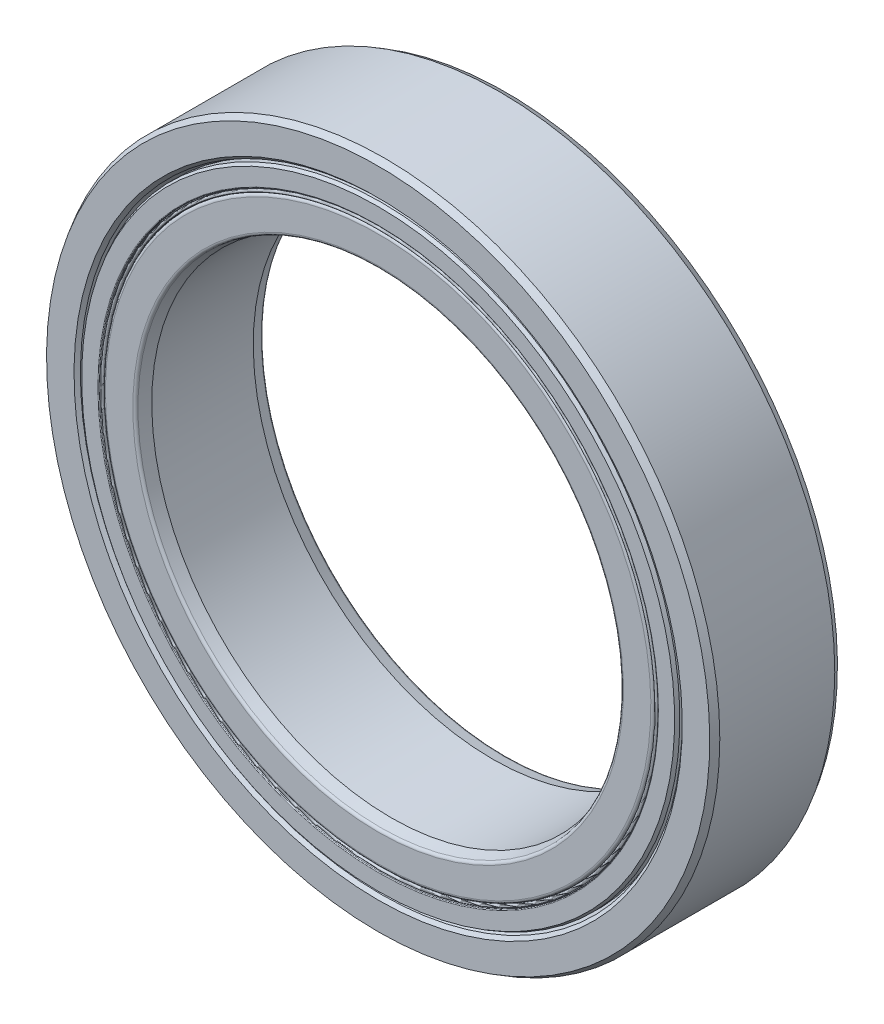
ISO-10303-21;
HEADER;
FILE_DESCRIPTION(('STEP AP214'),'2;1');
FILE_NAME('part.step','',(''),(''),'','','');
FILE_SCHEMA(('AUTOMOTIVE_DESIGN { 1 0 10303 214 1 1 1 1 }'));
ENDSEC;
DATA;
#1=APPLICATION_CONTEXT('core data for automotive mechanical design processes');
#2=APPLICATION_PROTOCOL_DEFINITION('international standard','automotive_design',2000,#1);
#3=PRODUCT_CONTEXT('',#1,'mechanical');
#4=PRODUCT('Part','Part','',(#3));
#5=PRODUCT_RELATED_PRODUCT_CATEGORY('part','',(#4));
#6=PRODUCT_DEFINITION_FORMATION('','',#4);
#7=PRODUCT_DEFINITION_CONTEXT('part definition',#1,'design');
#8=PRODUCT_DEFINITION('design','',#6,#7);
#9=PRODUCT_DEFINITION_SHAPE('','',#8);
#10=(LENGTH_UNIT() NAMED_UNIT(*) SI_UNIT(.MILLI.,.METRE.));
#11=(NAMED_UNIT(*) PLANE_ANGLE_UNIT() SI_UNIT($,.RADIAN.));
#12=(NAMED_UNIT(*) SI_UNIT($,.STERADIAN.) SOLID_ANGLE_UNIT());
#13=UNCERTAINTY_MEASURE_WITH_UNIT(LENGTH_MEASURE(1.E-05),#10,'distance_accuracy_value','');
#14=(GEOMETRIC_REPRESENTATION_CONTEXT(3) GLOBAL_UNCERTAINTY_ASSIGNED_CONTEXT((#13)) GLOBAL_UNIT_ASSIGNED_CONTEXT((#10,
#11,#12)) REPRESENTATION_CONTEXT('',''));
#15=CARTESIAN_POINT('',(0.,0.,0.));
#16=DIRECTION('',(0.,0.,1.));
#17=DIRECTION('',(1.,0.,0.));
#18=AXIS2_PLACEMENT_3D('',#15,#16,#17);
#19=CARTESIAN_POINT('',(0.,8.635,1.125));
#20=DIRECTION('',(0.,0.,1.));
#21=DIRECTION('',(0.,-1.,0.));
#22=AXIS2_PLACEMENT_3D('',#19,#20,#21);
#23=PLANE('',#22);
#24=CARTESIAN_POINT('',(0.,0.,1.125));
#25=DIRECTION('',(0.,0.,1.));
#26=DIRECTION('',(0.,-1.,0.));
#27=AXIS2_PLACEMENT_3D('',#24,#25,#26);
#28=CIRCLE('',#27,8.755);
#29=CARTESIAN_POINT('',(0.,-8.755,1.125));
#30=VERTEX_POINT('',#29);
#31=EDGE_CURVE('E11',#30,#30,#28,.T.);
#32=ORIENTED_EDGE('',*,*,#31,.F.);
#33=EDGE_LOOP('',(#32));
#34=FACE_BOUND('',#33,.T.);
#35=CARTESIAN_POINT('',(0.,0.,1.125));
#36=DIRECTION('',(0.,0.,1.));
#37=DIRECTION('',(0.,-1.,0.));
#38=AXIS2_PLACEMENT_3D('',#35,#36,#37);
#39=CIRCLE('',#38,8.635);
#40=CARTESIAN_POINT('',(0.,-8.635,1.125));
#41=VERTEX_POINT('',#40);
#42=EDGE_CURVE('E66',#41,#41,#39,.T.);
#43=ORIENTED_EDGE('',*,*,#42,.T.);
#44=EDGE_LOOP('',(#43));
#45=FACE_BOUND('',#44,.T.);
#46=ADVANCED_FACE('F41',(#34,#45),#23,.F.);
#47=CARTESIAN_POINT('',(0.,0.,2.));
#48=DIRECTION('',(0.,0.,1.));
#49=DIRECTION('',(0.,-1.,0.));
#50=AXIS2_PLACEMENT_3D('',#47,#48,#49);
#51=CYLINDRICAL_SURFACE('',#50,8.755);
#52=CARTESIAN_POINT('',(0.,0.,1.90262465990578));
#53=DIRECTION('',(0.,0.,1.));
#54=DIRECTION('',(0.,-1.,0.));
#55=AXIS2_PLACEMENT_3D('',#52,#53,#54);
#56=CIRCLE('',#55,8.755);
#57=CARTESIAN_POINT('',(0.,-8.755,1.90262465990578));
#58=VERTEX_POINT('',#57);
#59=EDGE_CURVE('E47',#58,#58,#56,.T.);
#60=ORIENTED_EDGE('',*,*,#59,.F.);
#61=EDGE_LOOP('',(#60));
#62=FACE_BOUND('',#61,.T.);
#63=ORIENTED_EDGE('',*,*,#31,.T.);
#64=EDGE_LOOP('',(#63));
#65=FACE_BOUND('',#64,.T.);
#66=ADVANCED_FACE('F97',(#62,#65),#51,.T.);
#67=CARTESIAN_POINT('',(0.,0.,1.90262465990578));
#68=DIRECTION('',(0.,0.,-1.));
#69=DIRECTION('',(0.,1.,0.));
#70=AXIS2_PLACEMENT_3D('',#67,#68,#69);
#71=CONICAL_SURFACE('',#70,8.755,0.174532925199435);
#72=CARTESIAN_POINT('',(0.,0.,1.93216889249614));
#73=DIRECTION('',(0.,0.,1.));
#74=DIRECTION('',(0.,-1.,0.));
#75=AXIS2_PLACEMENT_3D('',#72,#73,#74);
#76=CIRCLE('',#75,8.74979055467);
#77=CARTESIAN_POINT('',(0.,-8.74979055467,1.93216889249614));
#78=VERTEX_POINT('',#77);
#79=EDGE_CURVE('E51',#78,#78,#76,.T.);
#80=ORIENTED_EDGE('',*,*,#79,.F.);
#81=EDGE_LOOP('',(#80));
#82=FACE_BOUND('',#81,.T.);
#83=ORIENTED_EDGE('',*,*,#59,.T.);
#84=EDGE_LOOP('',(#83));
#85=FACE_BOUND('',#84,.T.);
#86=ADVANCED_FACE('F92',(#82,#85),#71,.T.);
#87=CARTESIAN_POINT('',(0.,0.,1.93));
#88=DIRECTION('',(0.,0.,1.));
#89=DIRECTION('',(0.,-1.,0.));
#90=AXIS2_PLACEMENT_3D('',#87,#88,#89);
#91=TOROIDAL_SURFACE('',#90,8.73749015408791,0.0124901540879057);
#92=CARTESIAN_POINT('',(0.,0.,1.93));
#93=DIRECTION('',(0.,0.,1.));
#94=DIRECTION('',(0.,-1.,0.));
#95=AXIS2_PLACEMENT_3D('',#92,#93,#94);
#96=CIRCLE('',#95,8.725);
#97=CARTESIAN_POINT('',(0.,-8.725,1.93));
#98=VERTEX_POINT('',#97);
#99=EDGE_CURVE('E55',#98,#98,#96,.T.);
#100=ORIENTED_EDGE('',*,*,#99,.F.);
#101=EDGE_LOOP('',(#100));
#102=FACE_BOUND('',#101,.T.);
#103=ORIENTED_EDGE('',*,*,#79,.T.);
#104=EDGE_LOOP('',(#103));
#105=FACE_BOUND('',#104,.T.);
#106=ADVANCED_FACE('F86',(#102,#105),#91,.T.);
#107=CARTESIAN_POINT('',(0.,0.,2.));
#108=DIRECTION('',(0.,0.,1.));
#109=DIRECTION('',(0.,-1.,0.));
#110=AXIS2_PLACEMENT_3D('',#107,#108,#109);
#111=CYLINDRICAL_SURFACE('',#110,8.725);
#112=CARTESIAN_POINT('',(0.,0.,1.955));
#113=DIRECTION('',(0.,0.,1.));
#114=DIRECTION('',(0.,-1.,0.));
#115=AXIS2_PLACEMENT_3D('',#112,#113,#114);
#116=CIRCLE('',#115,8.725);
#117=CARTESIAN_POINT('',(0.,-8.725,1.955));
#118=VERTEX_POINT('',#117);
#119=EDGE_CURVE('E60',#118,#118,#116,.T.);
#120=ORIENTED_EDGE('',*,*,#119,.F.);
#121=EDGE_LOOP('',(#120));
#122=FACE_BOUND('',#121,.T.);
#123=ORIENTED_EDGE('',*,*,#99,.T.);
#124=EDGE_LOOP('',(#123));
#125=FACE_BOUND('',#124,.T.);
#126=ADVANCED_FACE('F80',(#122,#125),#111,.T.);
#127=CARTESIAN_POINT('',(0.,0.,1.955));
#128=DIRECTION('',(0.,0.,1.));
#129=DIRECTION('',(0.,-1.,0.));
#130=AXIS2_PLACEMENT_3D('',#127,#128,#129);
#131=TOROIDAL_SURFACE('',#130,8.68,0.0450000000000016);
#132=CARTESIAN_POINT('',(0.,0.,1.955));
#133=DIRECTION('',(0.,0.,1.));
#134=DIRECTION('',(0.,-1.,0.));
#135=AXIS2_PLACEMENT_3D('',#132,#133,#134);
#136=CIRCLE('',#135,8.635);
#137=CARTESIAN_POINT('',(0.,-8.635,1.955));
#138=VERTEX_POINT('',#137);
#139=EDGE_CURVE('E63',#138,#138,#136,.T.);
#140=ORIENTED_EDGE('',*,*,#139,.F.);
#141=EDGE_LOOP('',(#140));
#142=FACE_BOUND('',#141,.T.);
#143=ORIENTED_EDGE('',*,*,#119,.T.);
#144=EDGE_LOOP('',(#143));
#145=FACE_BOUND('',#144,.T.);
#146=ADVANCED_FACE('F74',(#142,#145),#131,.T.);
#147=CARTESIAN_POINT('',(0.,0.,2.));
#148=DIRECTION('',(0.,0.,1.));
#149=DIRECTION('',(0.,-1.,0.));
#150=AXIS2_PLACEMENT_3D('',#147,#148,#149);
#151=CYLINDRICAL_SURFACE('',#150,8.635);
#152=ORIENTED_EDGE('',*,*,#42,.F.);
#153=EDGE_LOOP('',(#152));
#154=FACE_BOUND('',#153,.T.);
#155=ORIENTED_EDGE('',*,*,#139,.T.);
#156=EDGE_LOOP('',(#155));
#157=FACE_BOUND('',#156,.T.);
#158=ADVANCED_FACE('F71',(#154,#157),#151,.F.);
#159=CLOSED_SHELL('',(#46,#66,#86,#106,#126,#146,#158));
#160=MANIFOLD_SOLID_BREP('B2',#159);
#161=CARTESIAN_POINT('',(0.,0.,-2.));
#162=DIRECTION('',(0.,0.,1.));
#163=DIRECTION('',(0.,-1.,0.));
#164=AXIS2_PLACEMENT_3D('',#161,#162,#163);
#165=CONICAL_SURFACE('',#164,9.285,0.523598775598309);
#166=CARTESIAN_POINT('',(0.,0.,-1.89607695154587));
#167=DIRECTION('',(0.,0.,1.));
#168=DIRECTION('',(0.,-1.,0.));
#169=AXIS2_PLACEMENT_3D('',#166,#167,#168);
#170=CIRCLE('',#169,9.345);
#171=CARTESIAN_POINT('',(0.,-9.345,-1.89607695154587));
#172=VERTEX_POINT('',#171);
#173=EDGE_CURVE('E177',#172,#172,#170,.T.);
#174=ORIENTED_EDGE('',*,*,#173,.F.);
#175=EDGE_LOOP('',(#174));
#176=FACE_BOUND('',#175,.T.);
#177=CARTESIAN_POINT('',(0.,0.,-2.));
#178=DIRECTION('',(0.,0.,1.));
#179=DIRECTION('',(0.,-1.,0.));
#180=AXIS2_PLACEMENT_3D('',#177,#178,#179);
#181=CIRCLE('',#180,9.285);
#182=CARTESIAN_POINT('',(0.,-9.285,-2.00000000000001));
#183=VERTEX_POINT('',#182);
#184=EDGE_CURVE('E40',#183,#183,#181,.T.);
#185=ORIENTED_EDGE('',*,*,#184,.T.);
#186=EDGE_LOOP('',(#185));
#187=FACE_BOUND('',#186,.T.);
#188=ADVANCED_FACE('F155',(#176,#187),#165,.T.);
#189=CARTESIAN_POINT('',(0.,9.285,-2.));
#190=DIRECTION('',(0.,0.,1.));
#191=DIRECTION('',(0.,-1.,0.));
#192=AXIS2_PLACEMENT_3D('',#189,#190,#191);
#193=PLANE('',#192);
#194=ORIENTED_EDGE('',*,*,#184,.F.);
#195=EDGE_LOOP('',(#194));
#196=FACE_BOUND('',#195,.T.);
#197=CARTESIAN_POINT('',(0.,0.,-2.));
#198=DIRECTION('',(0.,0.,1.));
#199=DIRECTION('',(0.,-1.,0.));
#200=AXIS2_PLACEMENT_3D('',#197,#198,#199);
#201=CIRCLE('',#200,8.779);
#202=CARTESIAN_POINT('',(0.,-8.779,-2.00000000000001));
#203=VERTEX_POINT('',#202);
#204=EDGE_CURVE('E161',#203,#203,#201,.T.);
#205=ORIENTED_EDGE('',*,*,#204,.T.);
#206=EDGE_LOOP('',(#205));
#207=FACE_BOUND('',#206,.T.);
#208=ADVANCED_FACE('F184',(#196,#207),#193,.F.);
#209=CARTESIAN_POINT('',(0.,0.,-1.976));
#210=DIRECTION('',(0.,0.,1.));
#211=DIRECTION('',(0.,-1.,0.));
#212=AXIS2_PLACEMENT_3D('',#209,#210,#211);
#213=TOROIDAL_SURFACE('',#212,8.779,0.0239999999999991);
#214=ORIENTED_EDGE('',*,*,#204,.F.);
#215=EDGE_LOOP('',(#214));
#216=FACE_BOUND('',#215,.T.);
#217=CARTESIAN_POINT('',(0.,0.,-1.976));
#218=DIRECTION('',(0.,0.,1.));
#219=DIRECTION('',(0.,-1.,0.));
#220=AXIS2_PLACEMENT_3D('',#217,#218,#219);
#221=CIRCLE('',#220,8.755);
#222=CARTESIAN_POINT('',(0.,-8.755,-1.97600000000001));
#223=VERTEX_POINT('',#222);
#224=EDGE_CURVE('E165',#223,#223,#221,.T.);
#225=ORIENTED_EDGE('',*,*,#224,.T.);
#226=EDGE_LOOP('',(#225));
#227=FACE_BOUND('',#226,.T.);
#228=ADVANCED_FACE('F188',(#216,#227),#213,.T.);
#229=CARTESIAN_POINT('',(0.,0.,2.));
#230=DIRECTION('',(0.,0.,1.));
#231=DIRECTION('',(0.,-1.,0.));
#232=AXIS2_PLACEMENT_3D('',#229,#230,#231);
#233=CYLINDRICAL_SURFACE('',#232,8.755);
#234=ORIENTED_EDGE('',*,*,#224,.F.);
#235=EDGE_LOOP('',(#234));
#236=FACE_BOUND('',#235,.T.);
#237=CARTESIAN_POINT('',(0.,0.,-1.125));
#238=DIRECTION('',(0.,0.,1.));
#239=DIRECTION('',(0.,-1.,0.));
#240=AXIS2_PLACEMENT_3D('',#237,#238,#239);
#241=CIRCLE('',#240,8.755);
#242=CARTESIAN_POINT('',(0.,-8.755,-1.125));
#243=VERTEX_POINT('',#242);
#244=EDGE_CURVE('E169',#243,#243,#241,.T.);
#245=ORIENTED_EDGE('',*,*,#244,.T.);
#246=EDGE_LOOP('',(#245));
#247=FACE_BOUND('',#246,.T.);
#248=ADVANCED_FACE('F193',(#236,#247),#233,.F.);
#249=CARTESIAN_POINT('',(0.,9.345,-1.125));
#250=DIRECTION('',(0.,0.,-1.));
#251=DIRECTION('',(0.,1.,0.));
#252=AXIS2_PLACEMENT_3D('',#249,#250,#251);
#253=PLANE('',#252);
#254=ORIENTED_EDGE('',*,*,#244,.F.);
#255=EDGE_LOOP('',(#254));
#256=FACE_BOUND('',#255,.T.);
#257=CARTESIAN_POINT('',(0.,0.,-1.125));
#258=DIRECTION('',(0.,0.,1.));
#259=DIRECTION('',(0.,-1.,0.));
#260=AXIS2_PLACEMENT_3D('',#257,#258,#259);
#261=CIRCLE('',#260,9.345);
#262=CARTESIAN_POINT('',(0.,-9.345,-1.125));
#263=VERTEX_POINT('',#262);
#264=EDGE_CURVE('E174',#263,#263,#261,.T.);
#265=ORIENTED_EDGE('',*,*,#264,.T.);
#266=EDGE_LOOP('',(#265));
#267=FACE_BOUND('',#266,.T.);
#268=ADVANCED_FACE('F199',(#256,#267),#253,.F.);
#269=CARTESIAN_POINT('',(0.,0.,2.));
#270=DIRECTION('',(0.,0.,1.));
#271=DIRECTION('',(0.,-1.,0.));
#272=AXIS2_PLACEMENT_3D('',#269,#270,#271);
#273=CYLINDRICAL_SURFACE('',#272,9.345);
#274=ORIENTED_EDGE('',*,*,#264,.F.);
#275=EDGE_LOOP('',(#274));
#276=FACE_BOUND('',#275,.T.);
#277=ORIENTED_EDGE('',*,*,#173,.T.);
#278=EDGE_LOOP('',(#277));
#279=FACE_BOUND('',#278,.T.);
#280=ADVANCED_FACE('F181',(#276,#279),#273,.T.);
#281=CLOSED_SHELL('',(#188,#208,#228,#248,#268,#280));
#282=MANIFOLD_SOLID_BREP('B6',#281);
#283=CARTESIAN_POINT('',(0.,9.345,1.125));
#284=DIRECTION('',(0.,0.,1.));
#285=DIRECTION('',(0.,-1.,0.));
#286=AXIS2_PLACEMENT_3D('',#283,#284,#285);
#287=PLANE('',#286);
#288=CARTESIAN_POINT('',(0.,0.,1.125));
#289=DIRECTION('',(0.,0.,1.));
#290=DIRECTION('',(0.,-1.,0.));
#291=AXIS2_PLACEMENT_3D('',#288,#289,#290);
#292=CIRCLE('',#291,9.345);
#293=CARTESIAN_POINT('',(0.,-9.345,1.125));
#294=VERTEX_POINT('',#293);
#295=EDGE_CURVE('E154',#294,#294,#292,.T.);
#296=ORIENTED_EDGE('',*,*,#295,.F.);
#297=EDGE_LOOP('',(#296));
#298=FACE_BOUND('',#297,.T.);
#299=CARTESIAN_POINT('',(0.,0.,1.125));
#300=DIRECTION('',(0.,0.,1.));
#301=DIRECTION('',(0.,-1.,0.));
#302=AXIS2_PLACEMENT_3D('',#299,#300,#301);
#303=CIRCLE('',#302,8.755);
#304=CARTESIAN_POINT('',(0.,-8.755,1.125));
#305=VERTEX_POINT('',#304);
#306=EDGE_CURVE('E274',#305,#305,#303,.T.);
#307=ORIENTED_EDGE('',*,*,#306,.T.);
#308=EDGE_LOOP('',(#307));
#309=FACE_BOUND('',#308,.T.);
#310=ADVANCED_FACE('F252',(#298,#309),#287,.F.);
#311=CARTESIAN_POINT('',(0.,0.,2.));
#312=DIRECTION('',(0.,0.,1.));
#313=DIRECTION('',(0.,-1.,0.));
#314=AXIS2_PLACEMENT_3D('',#311,#312,#313);
#315=CYLINDRICAL_SURFACE('',#314,9.345);
#316=CARTESIAN_POINT('',(0.,0.,1.89607695154587));
#317=DIRECTION('',(0.,0.,1.));
#318=DIRECTION('',(0.,-1.,0.));
#319=AXIS2_PLACEMENT_3D('',#316,#317,#318);
#320=CIRCLE('',#319,9.345);
#321=CARTESIAN_POINT('',(0.,-9.345,1.89607695154587));
#322=VERTEX_POINT('',#321);
#323=EDGE_CURVE('E258',#322,#322,#320,.T.);
#324=ORIENTED_EDGE('',*,*,#323,.F.);
#325=EDGE_LOOP('',(#324));
#326=FACE_BOUND('',#325,.T.);
#327=ORIENTED_EDGE('',*,*,#295,.T.);
#328=EDGE_LOOP('',(#327));
#329=FACE_BOUND('',#328,.T.);
#330=ADVANCED_FACE('F299',(#326,#329),#315,.T.);
#331=CARTESIAN_POINT('',(0.,0.,1.89607695154587));
#332=DIRECTION('',(0.,0.,-1.));
#333=DIRECTION('',(0.,1.,0.));
#334=AXIS2_PLACEMENT_3D('',#331,#332,#333);
#335=CONICAL_SURFACE('',#334,9.345,0.523598775598311);
#336=CARTESIAN_POINT('',(0.,0.,2.));
#337=DIRECTION('',(0.,0.,1.));
#338=DIRECTION('',(0.,-1.,0.));
#339=AXIS2_PLACEMENT_3D('',#336,#337,#338);
#340=CIRCLE('',#339,9.285);
#341=CARTESIAN_POINT('',(0.,-9.285,2.));
#342=VERTEX_POINT('',#341);
#343=EDGE_CURVE('E262',#342,#342,#340,.T.);
#344=ORIENTED_EDGE('',*,*,#343,.F.);
#345=EDGE_LOOP('',(#344));
#346=FACE_BOUND('',#345,.T.);
#347=ORIENTED_EDGE('',*,*,#323,.T.);
#348=EDGE_LOOP('',(#347));
#349=FACE_BOUND('',#348,.T.);
#350=ADVANCED_FACE('F294',(#346,#349),#335,.T.);
#351=CARTESIAN_POINT('',(0.,9.285,2.));
#352=DIRECTION('',(0.,0.,-1.));
#353=DIRECTION('',(0.,1.,0.));
#354=AXIS2_PLACEMENT_3D('',#351,#352,#353);
#355=PLANE('',#354);
#356=CARTESIAN_POINT('',(0.,0.,2.));
#357=DIRECTION('',(0.,0.,1.));
#358=DIRECTION('',(0.,-1.,0.));
#359=AXIS2_PLACEMENT_3D('',#356,#357,#358);
#360=CIRCLE('',#359,8.779);
#361=CARTESIAN_POINT('',(0.,-8.779,2.));
#362=VERTEX_POINT('',#361);
#363=EDGE_CURVE('E266',#362,#362,#360,.T.);
#364=ORIENTED_EDGE('',*,*,#363,.F.);
#365=EDGE_LOOP('',(#364));
#366=FACE_BOUND('',#365,.T.);
#367=ORIENTED_EDGE('',*,*,#343,.T.);
#368=EDGE_LOOP('',(#367));
#369=FACE_BOUND('',#368,.T.);
#370=ADVANCED_FACE('F288',(#366,#369),#355,.F.);
#371=CARTESIAN_POINT('',(0.,0.,1.976));
#372=DIRECTION('',(0.,0.,1.));
#373=DIRECTION('',(0.,-1.,0.));
#374=AXIS2_PLACEMENT_3D('',#371,#372,#373);
#375=TOROIDAL_SURFACE('',#374,8.779,0.0239999999999991);
#376=CARTESIAN_POINT('',(0.,0.,1.976));
#377=DIRECTION('',(0.,0.,1.));
#378=DIRECTION('',(0.,-1.,0.));
#379=AXIS2_PLACEMENT_3D('',#376,#377,#378);
#380=CIRCLE('',#379,8.755);
#381=CARTESIAN_POINT('',(0.,-8.755,1.976));
#382=VERTEX_POINT('',#381);
#383=EDGE_CURVE('E271',#382,#382,#380,.T.);
#384=ORIENTED_EDGE('',*,*,#383,.F.);
#385=EDGE_LOOP('',(#384));
#386=FACE_BOUND('',#385,.T.);
#387=ORIENTED_EDGE('',*,*,#363,.T.);
#388=EDGE_LOOP('',(#387));
#389=FACE_BOUND('',#388,.T.);
#390=ADVANCED_FACE('F282',(#386,#389),#375,.T.);
#391=CARTESIAN_POINT('',(0.,0.,2.));
#392=DIRECTION('',(0.,0.,1.));
#393=DIRECTION('',(0.,-1.,0.));
#394=AXIS2_PLACEMENT_3D('',#391,#392,#393);
#395=CYLINDRICAL_SURFACE('',#394,8.755);
#396=ORIENTED_EDGE('',*,*,#306,.F.);
#397=EDGE_LOOP('',(#396));
#398=FACE_BOUND('',#397,.T.);
#399=ORIENTED_EDGE('',*,*,#383,.T.);
#400=EDGE_LOOP('',(#399));
#401=FACE_BOUND('',#400,.T.);
#402=ADVANCED_FACE('F279',(#398,#401),#395,.F.);
#403=CLOSED_SHELL('',(#310,#330,#350,#370,#390,#402));
#404=MANIFOLD_SOLID_BREP('B35',#403);
#405=CARTESIAN_POINT('',(-3.44032405696204,8.30567699727652,0.));
#406=DIRECTION('',(0.,0.,1.));
#407=DIRECTION('',(-0.382683432365077,0.923879532511292,0.));
#408=AXIS2_PLACEMENT_3D('',#405,#406,#407);
#409=SPHERICAL_SURFACE('',#408,1.125);
#410=CARTESIAN_POINT('',(-3.44032405696204,8.30567699727652,1.125));
#411=VERTEX_POINT('',#410);
#412=VERTEX_LOOP('',#411);
#413=FACE_BOUND('',#412,.T.);
#414=ADVANCED_FACE('F362',(#413),#409,.T.);
#415=CLOSED_SHELL('',(#414));
#416=MANIFOLD_SOLID_BREP('B149',#415);
#417=CARTESIAN_POINT('',(-6.35688996286699,6.35688996286714,0.));
#418=DIRECTION('',(0.,0.,1.));
#419=DIRECTION('',(-0.707106781186539,0.707106781186556,0.));
#420=AXIS2_PLACEMENT_3D('',#417,#418,#419);
#421=SPHERICAL_SURFACE('',#420,1.125);
#422=CARTESIAN_POINT('',(-6.35688996286699,6.35688996286714,1.125));
#423=VERTEX_POINT('',#422);
#424=VERTEX_LOOP('',#423);
#425=FACE_BOUND('',#424,.T.);
#426=ADVANCED_FACE('F380',(#425),#421,.T.);
#427=CLOSED_SHELL('',(#426));
#428=MANIFOLD_SOLID_BREP('B248',#427);
#429=CARTESIAN_POINT('',(-8.30567699727643,3.44032405696225,0.));
#430=DIRECTION('',(0.,0.,1.));
#431=DIRECTION('',(-0.923879532511283,0.3826834323651,0.));
#432=AXIS2_PLACEMENT_3D('',#429,#430,#431);
#433=SPHERICAL_SURFACE('',#432,1.125);
#434=CARTESIAN_POINT('',(-8.30567699727643,3.44032405696225,1.125));
#435=VERTEX_POINT('',#434);
#436=VERTEX_LOOP('',#435);
#437=FACE_BOUND('',#436,.T.);
#438=ADVANCED_FACE('F398',(#437),#433,.T.);
#439=CLOSED_SHELL('',(#438));
#440=MANIFOLD_SOLID_BREP('B358',#439);
#441=CARTESIAN_POINT('',(-8.99,0.,0.));
#442=DIRECTION('',(0.,0.,1.));
#443=DIRECTION('',(-1.,0.,0.));
#444=AXIS2_PLACEMENT_3D('',#441,#442,#443);
#445=SPHERICAL_SURFACE('',#444,1.125);
#446=CARTESIAN_POINT('',(-8.99,0.,1.125));
#447=VERTEX_POINT('',#446);
#448=VERTEX_LOOP('',#447);
#449=FACE_BOUND('',#448,.T.);
#450=ADVANCED_FACE('F416',(#449),#445,.T.);
#451=CLOSED_SHELL('',(#450));
#452=MANIFOLD_SOLID_BREP('B376',#451);
#453=CARTESIAN_POINT('',(-8.3056769972765,-3.44032405696207,0.));
#454=DIRECTION('',(0.,0.,1.));
#455=DIRECTION('',(-0.923879532511291,-0.382683432365081,0.));
#456=AXIS2_PLACEMENT_3D('',#453,#454,#455);
#457=SPHERICAL_SURFACE('',#456,1.125);
#458=CARTESIAN_POINT('',(-8.3056769972765,-3.44032405696207,1.125));
#459=VERTEX_POINT('',#458);
#460=VERTEX_LOOP('',#459);
#461=FACE_BOUND('',#460,.T.);
#462=ADVANCED_FACE('F434',(#461),#457,.T.);
#463=CLOSED_SHELL('',(#462));
#464=MANIFOLD_SOLID_BREP('B394',#463);
#465=CARTESIAN_POINT('',(-6.35688996286712,-6.35688996286701,0.));
#466=DIRECTION('',(0.,0.,1.));
#467=DIRECTION('',(-0.707106781186554,-0.707106781186541,0.));
#468=AXIS2_PLACEMENT_3D('',#465,#466,#467);
#469=SPHERICAL_SURFACE('',#468,1.125);
#470=CARTESIAN_POINT('',(-6.35688996286712,-6.35688996286701,1.12499999999999));
#471=VERTEX_POINT('',#470);
#472=VERTEX_LOOP('',#471);
#473=FACE_BOUND('',#472,.T.);
#474=ADVANCED_FACE('F452',(#473),#469,.T.);
#475=CLOSED_SHELL('',(#474));
#476=MANIFOLD_SOLID_BREP('B412',#475);
#477=CARTESIAN_POINT('',(-3.44032405696222,-8.30567699727644,0.));
#478=DIRECTION('',(0.,0.,1.));
#479=DIRECTION('',(-0.382683432365097,-0.923879532511284,0.));
#480=AXIS2_PLACEMENT_3D('',#477,#478,#479);
#481=SPHERICAL_SURFACE('',#480,1.125);
#482=CARTESIAN_POINT('',(-3.44032405696222,-8.30567699727644,1.12499999999999));
#483=VERTEX_POINT('',#482);
#484=VERTEX_LOOP('',#483);
#485=FACE_BOUND('',#484,.T.);
#486=ADVANCED_FACE('F470',(#485),#481,.T.);
#487=CLOSED_SHELL('',(#486));
#488=MANIFOLD_SOLID_BREP('B430',#487);
#489=CARTESIAN_POINT('',(0.,-8.99,0.));
#490=DIRECTION('',(0.,0.,1.));
#491=DIRECTION('',(0.,-1.,0.));
#492=AXIS2_PLACEMENT_3D('',#489,#490,#491);
#493=SPHERICAL_SURFACE('',#492,1.125);
#494=CARTESIAN_POINT('',(0.,-8.99,1.12499999999999));
#495=VERTEX_POINT('',#494);
#496=VERTEX_LOOP('',#495);
#497=FACE_BOUND('',#496,.T.);
#498=ADVANCED_FACE('F488',(#497),#493,.T.);
#499=CLOSED_SHELL('',(#498));
#500=MANIFOLD_SOLID_BREP('B448',#499);
#501=CARTESIAN_POINT('',(3.44032405696211,-8.30567699727649,0.));
#502=DIRECTION('',(0.,0.,1.));
#503=DIRECTION('',(0.382683432365084,-0.923879532511289,0.));
#504=AXIS2_PLACEMENT_3D('',#501,#502,#503);
#505=SPHERICAL_SURFACE('',#504,1.125);
#506=CARTESIAN_POINT('',(3.44032405696211,-8.30567699727649,1.12499999999999));
#507=VERTEX_POINT('',#506);
#508=VERTEX_LOOP('',#507);
#509=FACE_BOUND('',#508,.T.);
#510=ADVANCED_FACE('F506',(#509),#505,.T.);
#511=CLOSED_SHELL('',(#510));
#512=MANIFOLD_SOLID_BREP('B466',#511);
#513=CARTESIAN_POINT('',(6.35688996286703,-6.3568899628671,0.));
#514=DIRECTION('',(0.,0.,1.));
#515=DIRECTION('',(0.707106781186544,-0.707106781186551,0.));
#516=AXIS2_PLACEMENT_3D('',#513,#514,#515);
#517=SPHERICAL_SURFACE('',#516,1.125);
#518=CARTESIAN_POINT('',(6.35688996286703,-6.3568899628671,1.12499999999999));
#519=VERTEX_POINT('',#518);
#520=VERTEX_LOOP('',#519);
#521=FACE_BOUND('',#520,.T.);
#522=ADVANCED_FACE('F524',(#521),#517,.T.);
#523=CLOSED_SHELL('',(#522));
#524=MANIFOLD_SOLID_BREP('B484',#523);
#525=CARTESIAN_POINT('',(8.30567699727646,-3.44032405696219,0.));
#526=DIRECTION('',(0.,0.,1.));
#527=DIRECTION('',(0.923879532511285,-0.382683432365094,0.));
#528=AXIS2_PLACEMENT_3D('',#525,#526,#527);
#529=SPHERICAL_SURFACE('',#528,1.125);
#530=CARTESIAN_POINT('',(8.30567699727646,-3.4403240569622,1.125));
#531=VERTEX_POINT('',#530);
#532=VERTEX_LOOP('',#531);
#533=FACE_BOUND('',#532,.T.);
#534=ADVANCED_FACE('F542',(#533),#529,.T.);
#535=CLOSED_SHELL('',(#534));
#536=MANIFOLD_SOLID_BREP('B502',#535);
#537=CARTESIAN_POINT('',(8.99,0.,0.));
#538=DIRECTION('',(0.,0.,1.));
#539=DIRECTION('',(1.,0.,0.));
#540=AXIS2_PLACEMENT_3D('',#537,#538,#539);
#541=SPHERICAL_SURFACE('',#540,1.125);
#542=CARTESIAN_POINT('',(8.99,0.,1.125));
#543=VERTEX_POINT('',#542);
#544=VERTEX_LOOP('',#543);
#545=FACE_BOUND('',#544,.T.);
#546=ADVANCED_FACE('F560',(#545),#541,.T.);
#547=CLOSED_SHELL('',(#546));
#548=MANIFOLD_SOLID_BREP('B520',#547);
#549=CARTESIAN_POINT('',(8.30567699727648,3.44032405696214,0.));
#550=DIRECTION('',(0.,0.,1.));
#551=DIRECTION('',(0.923879532511288,0.382683432365087,0.));
#552=AXIS2_PLACEMENT_3D('',#549,#550,#551);
#553=SPHERICAL_SURFACE('',#552,1.125);
#554=CARTESIAN_POINT('',(8.30567699727648,3.44032405696214,1.125));
#555=VERTEX_POINT('',#554);
#556=VERTEX_LOOP('',#555);
#557=FACE_BOUND('',#556,.T.);
#558=ADVANCED_FACE('F578',(#557),#553,.T.);
#559=CLOSED_SHELL('',(#558));
#560=MANIFOLD_SOLID_BREP('B538',#559);
#561=CARTESIAN_POINT('',(6.35688996286707,6.35688996286705,0.));
#562=DIRECTION('',(0.,0.,1.));
#563=DIRECTION('',(0.707106781186549,0.707106781186546,0.));
#564=AXIS2_PLACEMENT_3D('',#561,#562,#563);
#565=SPHERICAL_SURFACE('',#564,1.125);
#566=CARTESIAN_POINT('',(6.35688996286707,6.35688996286705,1.125));
#567=VERTEX_POINT('',#566);
#568=VERTEX_LOOP('',#567);
#569=FACE_BOUND('',#568,.T.);
#570=ADVANCED_FACE('F596',(#569),#565,.T.);
#571=CLOSED_SHELL('',(#570));
#572=MANIFOLD_SOLID_BREP('B556',#571);
#573=CARTESIAN_POINT('',(3.44032405696217,8.30567699727647,0.));
#574=DIRECTION('',(0.,0.,1.));
#575=DIRECTION('',(0.382683432365091,0.923879532511287,0.));
#576=AXIS2_PLACEMENT_3D('',#573,#574,#575);
#577=SPHERICAL_SURFACE('',#576,1.125);
#578=CARTESIAN_POINT('',(3.44032405696217,8.30567699727647,1.125));
#579=VERTEX_POINT('',#578);
#580=VERTEX_LOOP('',#579);
#581=FACE_BOUND('',#580,.T.);
#582=ADVANCED_FACE('F614',(#581),#577,.T.);
#583=CLOSED_SHELL('',(#582));
#584=MANIFOLD_SOLID_BREP('B574',#583);
#585=CARTESIAN_POINT('',(0.,8.99,0.));
#586=DIRECTION('',(0.,0.,1.));
#587=DIRECTION('',(0.,1.,0.));
#588=AXIS2_PLACEMENT_3D('',#585,#586,#587);
#589=SPHERICAL_SURFACE('',#588,1.125);
#590=CARTESIAN_POINT('',(0.,8.99,1.125));
#591=VERTEX_POINT('',#590);
#592=VERTEX_LOOP('',#591);
#593=FACE_BOUND('',#592,.T.);
#594=ADVANCED_FACE('F634',(#593),#589,.T.);
#595=CLOSED_SHELL('',(#594));
#596=MANIFOLD_SOLID_BREP('B592',#595);
#597=CARTESIAN_POINT('',(0.,0.,-1.90553104853758));
#598=DIRECTION('',(0.,0.,1.));
#599=DIRECTION('',(0.,-1.,0.));
#600=AXIS2_PLACEMENT_3D('',#597,#598,#599);
#601=TOROIDAL_SURFACE('',#600,7.6825,0.0944689514624202);
#602=CARTESIAN_POINT('',(0.,0.,-2.));
#603=DIRECTION('',(0.,0.,1.));
#604=DIRECTION('',(0.,-1.,0.));
#605=AXIS2_PLACEMENT_3D('',#602,#603,#604);
#606=CIRCLE('',#605,7.6825);
#607=CARTESIAN_POINT('',(0.,-7.6825,-2.));
#608=VERTEX_POINT('',#607);
#609=EDGE_CURVE('E633',#608,#608,#606,.T.);
#610=ORIENTED_EDGE('',*,*,#609,.F.);
#611=EDGE_LOOP('',(#610));
#612=FACE_BOUND('',#611,.T.);
#613=CARTESIAN_POINT('',(0.,0.,-1.92998141234692));
#614=DIRECTION('',(0.,0.,1.));
#615=DIRECTION('',(0.,-1.,0.));
#616=AXIS2_PLACEMENT_3D('',#613,#614,#615);
#617=CIRCLE('',#616,7.59125);
#618=CARTESIAN_POINT('',(0.,-7.59125,-1.92998141234692));
#619=VERTEX_POINT('',#618);
#620=EDGE_CURVE('E693',#619,#619,#617,.T.);
#621=ORIENTED_EDGE('',*,*,#620,.T.);
#622=EDGE_LOOP('',(#621));
#623=FACE_BOUND('',#622,.T.);
#624=ADVANCED_FACE('F653',(#612,#623),#601,.T.);
#625=CARTESIAN_POINT('',(0.,7.6825,-2.));
#626=DIRECTION('',(0.,0.,1.));
#627=DIRECTION('',(0.,-1.,0.));
#628=AXIS2_PLACEMENT_3D('',#625,#626,#627);
#629=PLANE('',#628);
#630=CARTESIAN_POINT('',(0.,0.,-2.));
#631=DIRECTION('',(0.,0.,1.));
#632=DIRECTION('',(0.,-1.,0.));
#633=AXIS2_PLACEMENT_3D('',#630,#631,#632);
#634=CIRCLE('',#633,8.54053104853758);
#635=CARTESIAN_POINT('',(0.,-8.54053104853758,-2.));
#636=VERTEX_POINT('',#635);
#637=EDGE_CURVE('E659',#636,#636,#634,.T.);
#638=ORIENTED_EDGE('',*,*,#637,.F.);
#639=EDGE_LOOP('',(#638));
#640=FACE_BOUND('',#639,.T.);
#641=ORIENTED_EDGE('',*,*,#609,.T.);
#642=EDGE_LOOP('',(#641));
#643=FACE_BOUND('',#642,.T.);
#644=ADVANCED_FACE('F754',(#640,#643),#629,.F.);
#645=CARTESIAN_POINT('',(0.,0.,-1.90553104853758));
#646=DIRECTION('',(0.,0.,1.));
#647=DIRECTION('',(0.,-1.,0.));
#648=AXIS2_PLACEMENT_3D('',#645,#646,#647);
#649=TOROIDAL_SURFACE('',#648,8.54053104853758,0.0944689514624197);
#650=CARTESIAN_POINT('',(0.,0.,-1.90553104853758));
#651=DIRECTION('',(0.,0.,1.));
#652=DIRECTION('',(0.,-1.,0.));
#653=AXIS2_PLACEMENT_3D('',#650,#651,#652);
#654=CIRCLE('',#653,8.635);
#655=CARTESIAN_POINT('',(0.,-8.635,-1.90553104853758));
#656=VERTEX_POINT('',#655);
#657=EDGE_CURVE('E663',#656,#656,#654,.T.);
#658=ORIENTED_EDGE('',*,*,#657,.F.);
#659=EDGE_LOOP('',(#658));
#660=FACE_BOUND('',#659,.T.);
#661=ORIENTED_EDGE('',*,*,#637,.T.);
#662=EDGE_LOOP('',(#661));
#663=FACE_BOUND('',#662,.T.);
#664=ADVANCED_FACE('F749',(#660,#663),#649,.T.);
#665=CARTESIAN_POINT('',(0.,0.,2.));
#666=DIRECTION('',(0.,0.,1.));
#667=DIRECTION('',(0.,-1.,0.));
#668=AXIS2_PLACEMENT_3D('',#665,#666,#667);
#669=CYLINDRICAL_SURFACE('',#668,8.635);
#670=CARTESIAN_POINT('',(0.,0.,-1.0675204916066));
#671=DIRECTION('',(0.,0.,1.));
#672=DIRECTION('',(0.,-1.,0.));
#673=AXIS2_PLACEMENT_3D('',#670,#671,#672);
#674=CIRCLE('',#673,8.635);
#675=CARTESIAN_POINT('',(0.,-8.635,-1.0675204916066));
#676=VERTEX_POINT('',#675);
#677=EDGE_CURVE('E667',#676,#676,#674,.T.);
#678=ORIENTED_EDGE('',*,*,#677,.F.);
#679=EDGE_LOOP('',(#678));
#680=FACE_BOUND('',#679,.T.);
#681=ORIENTED_EDGE('',*,*,#657,.T.);
#682=EDGE_LOOP('',(#681));
#683=FACE_BOUND('',#682,.T.);
#684=ADVANCED_FACE('F743',(#680,#683),#669,.T.);
#685=CARTESIAN_POINT('',(0.,0.,0.));
#686=DIRECTION('',(0.,0.,1.));
#687=DIRECTION('',(0.,-1.,0.));
#688=AXIS2_PLACEMENT_3D('',#685,#686,#687);
#689=TOROIDAL_SURFACE('',#688,8.99,1.125);
#690=CARTESIAN_POINT('',(0.,0.,1.0675204916066));
#691=DIRECTION('',(0.,0.,1.));
#692=DIRECTION('',(0.,-1.,0.));
#693=AXIS2_PLACEMENT_3D('',#690,#691,#692);
#694=CIRCLE('',#693,8.635);
#695=CARTESIAN_POINT('',(0.,-8.635,1.0675204916066));
#696=VERTEX_POINT('',#695);
#697=EDGE_CURVE('E672',#696,#696,#694,.T.);
#698=ORIENTED_EDGE('',*,*,#697,.F.);
#699=EDGE_LOOP('',(#698));
#700=FACE_BOUND('',#699,.T.);
#701=ORIENTED_EDGE('',*,*,#677,.T.);
#702=EDGE_LOOP('',(#701));
#703=FACE_BOUND('',#702,.T.);
#704=ADVANCED_FACE('F737',(#700,#703),#689,.F.);
#705=CARTESIAN_POINT('',(0.,0.,2.));
#706=DIRECTION('',(0.,0.,1.));
#707=DIRECTION('',(0.,-1.,0.));
#708=AXIS2_PLACEMENT_3D('',#705,#706,#707);
#709=CYLINDRICAL_SURFACE('',#708,8.635);
#710=CARTESIAN_POINT('',(0.,0.,1.90553104853758));
#711=DIRECTION('',(0.,0.,1.));
#712=DIRECTION('',(0.,-1.,0.));
#713=AXIS2_PLACEMENT_3D('',#710,#711,#712);
#714=CIRCLE('',#713,8.635);
#715=CARTESIAN_POINT('',(0.,-8.635,1.90553104853758));
#716=VERTEX_POINT('',#715);
#717=EDGE_CURVE('E675',#716,#716,#714,.T.);
#718=ORIENTED_EDGE('',*,*,#717,.F.);
#719=EDGE_LOOP('',(#718));
#720=FACE_BOUND('',#719,.T.);
#721=ORIENTED_EDGE('',*,*,#697,.T.);
#722=EDGE_LOOP('',(#721));
#723=FACE_BOUND('',#722,.T.);
#724=ADVANCED_FACE('F731',(#720,#723),#709,.T.);
#725=CARTESIAN_POINT('',(0.,0.,1.90553104853758));
#726=DIRECTION('',(0.,0.,1.));
#727=DIRECTION('',(0.,-1.,0.));
#728=AXIS2_PLACEMENT_3D('',#725,#726,#727);
#729=TOROIDAL_SURFACE('',#728,8.54053104853758,0.0944689514624197);
#730=CARTESIAN_POINT('',(0.,0.,2.));
#731=DIRECTION('',(0.,0.,1.));
#732=DIRECTION('',(0.,-1.,0.));
#733=AXIS2_PLACEMENT_3D('',#730,#731,#732);
#734=CIRCLE('',#733,8.54053104853758);
#735=CARTESIAN_POINT('',(0.,-8.54053104853758,2.));
#736=VERTEX_POINT('',#735);
#737=EDGE_CURVE('E678',#736,#736,#734,.T.);
#738=ORIENTED_EDGE('',*,*,#737,.F.);
#739=EDGE_LOOP('',(#738));
#740=FACE_BOUND('',#739,.T.);
#741=ORIENTED_EDGE('',*,*,#717,.T.);
#742=EDGE_LOOP('',(#741));
#743=FACE_BOUND('',#742,.T.);
#744=ADVANCED_FACE('F725',(#740,#743),#729,.T.);
#745=CARTESIAN_POINT('',(0.,7.6825,2.));
#746=DIRECTION('',(0.,0.,-1.));
#747=DIRECTION('',(0.,1.,0.));
#748=AXIS2_PLACEMENT_3D('',#745,#746,#747);
#749=PLANE('',#748);
#750=CARTESIAN_POINT('',(0.,0.,2.));
#751=DIRECTION('',(0.,0.,1.));
#752=DIRECTION('',(0.,-1.,0.));
#753=AXIS2_PLACEMENT_3D('',#750,#751,#752);
#754=CIRCLE('',#753,7.6825);
#755=CARTESIAN_POINT('',(0.,-7.6825,2.));
#756=VERTEX_POINT('',#755);
#757=EDGE_CURVE('E681',#756,#756,#754,.T.);
#758=ORIENTED_EDGE('',*,*,#757,.F.);
#759=EDGE_LOOP('',(#758));
#760=FACE_BOUND('',#759,.T.);
#761=ORIENTED_EDGE('',*,*,#737,.T.);
#762=EDGE_LOOP('',(#761));
#763=FACE_BOUND('',#762,.T.);
#764=ADVANCED_FACE('F719',(#760,#763),#749,.F.);
#765=CARTESIAN_POINT('',(0.,0.,1.90553104853758));
#766=DIRECTION('',(0.,0.,1.));
#767=DIRECTION('',(0.,-1.,0.));
#768=AXIS2_PLACEMENT_3D('',#765,#766,#767);
#769=TOROIDAL_SURFACE('',#768,7.6825,0.0944689514624206);
#770=CARTESIAN_POINT('',(0.,0.,1.92998141234692));
#771=DIRECTION('',(0.,0.,1.));
#772=DIRECTION('',(0.,-1.,0.));
#773=AXIS2_PLACEMENT_3D('',#770,#771,#772);
#774=CIRCLE('',#773,7.59125);
#775=CARTESIAN_POINT('',(0.,-7.59125,1.92998141234692));
#776=VERTEX_POINT('',#775);
#777=EDGE_CURVE('E684',#776,#776,#774,.T.);
#778=ORIENTED_EDGE('',*,*,#777,.F.);
#779=EDGE_LOOP('',(#778));
#780=FACE_BOUND('',#779,.T.);
#781=ORIENTED_EDGE('',*,*,#757,.T.);
#782=EDGE_LOOP('',(#781));
#783=FACE_BOUND('',#782,.T.);
#784=ADVANCED_FACE('F713',(#780,#783),#769,.T.);
#785=CARTESIAN_POINT('',(0.,0.,1.92998141234692));
#786=DIRECTION('',(0.,0.,1.));
#787=DIRECTION('',(0.,-1.,0.));
#788=AXIS2_PLACEMENT_3D('',#785,#786,#787);
#789=CONICAL_SURFACE('',#788,7.59125,0.261799387799151);
#790=CARTESIAN_POINT('',(0.,0.,1.58943177615626));
#791=DIRECTION('',(0.,0.,1.));
#792=DIRECTION('',(0.,-1.,0.));
#793=AXIS2_PLACEMENT_3D('',#790,#791,#792);
#794=CIRCLE('',#793,7.5);
#795=CARTESIAN_POINT('',(0.,-7.5,1.58943177615626));
#796=VERTEX_POINT('',#795);
#797=EDGE_CURVE('E687',#796,#796,#794,.T.);
#798=ORIENTED_EDGE('',*,*,#797,.F.);
#799=EDGE_LOOP('',(#798));
#800=FACE_BOUND('',#799,.T.);
#801=ORIENTED_EDGE('',*,*,#777,.T.);
#802=EDGE_LOOP('',(#801));
#803=FACE_BOUND('',#802,.T.);
#804=ADVANCED_FACE('F707',(#800,#803),#789,.F.);
#805=CARTESIAN_POINT('',(0.,0.,2.));
#806=DIRECTION('',(0.,0.,1.));
#807=DIRECTION('',(0.,-1.,0.));
#808=AXIS2_PLACEMENT_3D('',#805,#806,#807);
#809=CYLINDRICAL_SURFACE('',#808,7.5);
#810=CARTESIAN_POINT('',(0.,0.,-1.58943177615626));
#811=DIRECTION('',(0.,0.,1.));
#812=DIRECTION('',(0.,-1.,0.));
#813=AXIS2_PLACEMENT_3D('',#810,#811,#812);
#814=CIRCLE('',#813,7.5);
#815=CARTESIAN_POINT('',(0.,-7.5,-1.58943177615626));
#816=VERTEX_POINT('',#815);
#817=EDGE_CURVE('E690',#816,#816,#814,.T.);
#818=ORIENTED_EDGE('',*,*,#817,.F.);
#819=EDGE_LOOP('',(#818));
#820=FACE_BOUND('',#819,.T.);
#821=ORIENTED_EDGE('',*,*,#797,.T.);
#822=EDGE_LOOP('',(#821));
#823=FACE_BOUND('',#822,.T.);
#824=ADVANCED_FACE('F701',(#820,#823),#809,.F.);
#825=CARTESIAN_POINT('',(0.,0.,-1.58943177615626));
#826=DIRECTION('',(0.,0.,-1.));
#827=DIRECTION('',(0.,1.,0.));
#828=AXIS2_PLACEMENT_3D('',#825,#826,#827);
#829=CONICAL_SURFACE('',#828,7.5,0.26179938779915);
#830=ORIENTED_EDGE('',*,*,#620,.F.);
#831=EDGE_LOOP('',(#830));
#832=FACE_BOUND('',#831,.T.);
#833=ORIENTED_EDGE('',*,*,#817,.T.);
#834=EDGE_LOOP('',(#833));
#835=FACE_BOUND('',#834,.T.);
#836=ADVANCED_FACE('F698',(#832,#835),#829,.F.);
#837=CLOSED_SHELL('',(#624,#644,#664,#684,#704,#724,#744,#764,#784,#804,#824,#836));
#838=MANIFOLD_SOLID_BREP('B610',#837);
#839=CARTESIAN_POINT('',(0.,0.,2.));
#840=DIRECTION('',(0.,0.,1.));
#841=DIRECTION('',(0.,-1.,0.));
#842=AXIS2_PLACEMENT_3D('',#839,#840,#841);
#843=CYLINDRICAL_SURFACE('',#842,9.345);
#844=CARTESIAN_POINT('',(0.,0.,1.0675204916066));
#845=DIRECTION('',(0.,0.,1.));
#846=DIRECTION('',(0.,-1.,0.));
#847=AXIS2_PLACEMENT_3D('',#844,#845,#846);
#848=CIRCLE('',#847,9.345);
#849=CARTESIAN_POINT('',(0.,-9.345,1.0675204916066));
#850=VERTEX_POINT('',#849);
#851=EDGE_CURVE('E652',#850,#850,#848,.T.);
#852=ORIENTED_EDGE('',*,*,#851,.F.);
#853=EDGE_LOOP('',(#852));
#854=FACE_BOUND('',#853,.T.);
#855=CARTESIAN_POINT('',(0.,0.,1.6829872849735));
#856=DIRECTION('',(0.,0.,1.));
#857=DIRECTION('',(0.,-1.,0.));
#858=AXIS2_PLACEMENT_3D('',#855,#856,#857);
#859=CIRCLE('',#858,9.345);
#860=CARTESIAN_POINT('',(0.,-9.345,1.6829872849735));
#861=VERTEX_POINT('',#860);
#862=EDGE_CURVE('E874',#861,#861,#859,.T.);
#863=ORIENTED_EDGE('',*,*,#862,.T.);
#864=EDGE_LOOP('',(#863));
#865=FACE_BOUND('',#864,.T.);
#866=ADVANCED_FACE('F834',(#854,#865),#843,.F.);
#867=CARTESIAN_POINT('',(0.,0.,0.));
#868=DIRECTION('',(0.,0.,1.));
#869=DIRECTION('',(0.,-1.,0.));
#870=AXIS2_PLACEMENT_3D('',#867,#868,#869);
#871=TOROIDAL_SURFACE('',#870,8.99,1.125);
#872=CARTESIAN_POINT('',(0.,0.,-1.0675204916066));
#873=DIRECTION('',(0.,0.,1.));
#874=DIRECTION('',(0.,-1.,0.));
#875=AXIS2_PLACEMENT_3D('',#872,#873,#874);
#876=CIRCLE('',#875,9.345);
#877=CARTESIAN_POINT('',(0.,-9.345,-1.0675204916066));
#878=VERTEX_POINT('',#877);
#879=EDGE_CURVE('E840',#878,#878,#876,.T.);
#880=ORIENTED_EDGE('',*,*,#879,.F.);
#881=EDGE_LOOP('',(#880));
#882=FACE_BOUND('',#881,.T.);
#883=ORIENTED_EDGE('',*,*,#851,.T.);
#884=EDGE_LOOP('',(#883));
#885=FACE_BOUND('',#884,.T.);
#886=ADVANCED_FACE('F935',(#882,#885),#871,.F.);
#887=CARTESIAN_POINT('',(0.,0.,2.));
#888=DIRECTION('',(0.,0.,1.));
#889=DIRECTION('',(0.,-1.,0.));
#890=AXIS2_PLACEMENT_3D('',#887,#888,#889);
#891=CYLINDRICAL_SURFACE('',#890,9.345);
#892=CARTESIAN_POINT('',(0.,0.,-1.6829872849735));
#893=DIRECTION('',(0.,0.,1.));
#894=DIRECTION('',(0.,-1.,0.));
#895=AXIS2_PLACEMENT_3D('',#892,#893,#894);
#896=CIRCLE('',#895,9.345);
#897=CARTESIAN_POINT('',(0.,-9.345,-1.68298728497351));
#898=VERTEX_POINT('',#897);
#899=EDGE_CURVE('E844',#898,#898,#896,.T.);
#900=ORIENTED_EDGE('',*,*,#899,.F.);
#901=EDGE_LOOP('',(#900));
#902=FACE_BOUND('',#901,.T.);
#903=ORIENTED_EDGE('',*,*,#879,.T.);
#904=EDGE_LOOP('',(#903));
#905=FACE_BOUND('',#904,.T.);
#906=ADVANCED_FACE('F930',(#902,#905),#891,.F.);
#907=CARTESIAN_POINT('',(0.,0.,-1.6829872849735));
#908=DIRECTION('',(0.,0.,-1.));
#909=DIRECTION('',(0.,1.,0.));
#910=AXIS2_PLACEMENT_3D('',#907,#908,#909);
#911=CONICAL_SURFACE('',#910,9.345,0.349065850398861);
#912=CARTESIAN_POINT('',(0.,0.,-1.9));
#913=DIRECTION('',(0.,0.,1.));
#914=DIRECTION('',(0.,-1.,0.));
#915=AXIS2_PLACEMENT_3D('',#912,#913,#914);
#916=CIRCLE('',#915,9.42398616872694);
#917=CARTESIAN_POINT('',(0.,-9.42398616872694,-1.90000000000001));
#918=VERTEX_POINT('',#917);
#919=EDGE_CURVE('E848',#918,#918,#916,.T.);
#920=ORIENTED_EDGE('',*,*,#919,.F.);
#921=EDGE_LOOP('',(#920));
#922=FACE_BOUND('',#921,.T.);
#923=ORIENTED_EDGE('',*,*,#899,.T.);
#924=EDGE_LOOP('',(#923));
#925=FACE_BOUND('',#924,.T.);
#926=ADVANCED_FACE('F924',(#922,#925),#911,.F.);
#927=CARTESIAN_POINT('',(0.,0.,-1.9));
#928=DIRECTION('',(0.,0.,-1.));
#929=DIRECTION('',(0.,1.,0.));
#930=AXIS2_PLACEMENT_3D('',#927,#928,#929);
#931=CONICAL_SURFACE('',#930,9.42398616872694,0.785398163397435);
#932=CARTESIAN_POINT('',(0.,0.,-2.));
#933=DIRECTION('',(0.,0.,1.));
#934=DIRECTION('',(0.,-1.,0.));
#935=AXIS2_PLACEMENT_3D('',#932,#933,#934);
#936=CIRCLE('',#935,9.52398616872694);
#937=CARTESIAN_POINT('',(0.,-9.52398616872694,-2.00000000000001));
#938=VERTEX_POINT('',#937);
#939=EDGE_CURVE('E853',#938,#938,#936,.T.);
#940=ORIENTED_EDGE('',*,*,#939,.F.);
#941=EDGE_LOOP('',(#940));
#942=FACE_BOUND('',#941,.T.);
#943=ORIENTED_EDGE('',*,*,#919,.T.);
#944=EDGE_LOOP('',(#943));
#945=FACE_BOUND('',#944,.T.);
#946=ADVANCED_FACE('F918',(#942,#945),#931,.F.);
#947=CARTESIAN_POINT('',(0.,10.3845299461621,-2.));
#948=DIRECTION('',(0.,0.,1.));
#949=DIRECTION('',(0.,-1.,0.));
#950=AXIS2_PLACEMENT_3D('',#947,#948,#949);
#951=PLANE('',#950);
#952=CARTESIAN_POINT('',(0.,0.,-2.));
#953=DIRECTION('',(0.,0.,1.));
#954=DIRECTION('',(0.,-1.,0.));
#955=AXIS2_PLACEMENT_3D('',#952,#953,#954);
#956=CIRCLE('',#955,10.3845299461621);
#957=CARTESIAN_POINT('',(0.,-10.3845299461621,-2.));
#958=VERTEX_POINT('',#957);
#959=EDGE_CURVE('E856',#958,#958,#956,.T.);
#960=ORIENTED_EDGE('',*,*,#959,.F.);
#961=EDGE_LOOP('',(#960));
#962=FACE_BOUND('',#961,.T.);
#963=ORIENTED_EDGE('',*,*,#939,.T.);
#964=EDGE_LOOP('',(#963));
#965=FACE_BOUND('',#964,.T.);
#966=ADVANCED_FACE('F912',(#962,#965),#951,.F.);
#967=CARTESIAN_POINT('',(0.,0.,-2.));
#968=DIRECTION('',(0.,0.,1.));
#969=DIRECTION('',(0.,-1.,0.));
#970=AXIS2_PLACEMENT_3D('',#967,#968,#969);
#971=CONICAL_SURFACE('',#970,10.3845299461621,0.523598775598292);
#972=CARTESIAN_POINT('',(0.,0.,-1.8));
#973=DIRECTION('',(0.,0.,1.));
#974=DIRECTION('',(0.,-1.,0.));
#975=AXIS2_PLACEMENT_3D('',#972,#973,#974);
#976=CIRCLE('',#975,10.5);
#977=CARTESIAN_POINT('',(0.,-10.5,-1.8));
#978=VERTEX_POINT('',#977);
#979=EDGE_CURVE('E859',#978,#978,#976,.T.);
#980=ORIENTED_EDGE('',*,*,#979,.F.);
#981=EDGE_LOOP('',(#980));
#982=FACE_BOUND('',#981,.T.);
#983=ORIENTED_EDGE('',*,*,#959,.T.);
#984=EDGE_LOOP('',(#983));
#985=FACE_BOUND('',#984,.T.);
#986=ADVANCED_FACE('F906',(#982,#985),#971,.T.);
#987=CARTESIAN_POINT('',(0.,0.,2.));
#988=DIRECTION('',(0.,0.,1.));
#989=DIRECTION('',(0.,-1.,0.));
#990=AXIS2_PLACEMENT_3D('',#987,#988,#989);
#991=CYLINDRICAL_SURFACE('',#990,10.5);
#992=CARTESIAN_POINT('',(0.,0.,1.8));
#993=DIRECTION('',(0.,0.,1.));
#994=DIRECTION('',(0.,-1.,0.));
#995=AXIS2_PLACEMENT_3D('',#992,#993,#994);
#996=CIRCLE('',#995,10.5);
#997=CARTESIAN_POINT('',(0.,-10.5,1.8));
#998=VERTEX_POINT('',#997);
#999=EDGE_CURVE('E862',#998,#998,#996,.T.);
#1000=ORIENTED_EDGE('',*,*,#999,.F.);
#1001=EDGE_LOOP('',(#1000));
#1002=FACE_BOUND('',#1001,.T.);
#1003=ORIENTED_EDGE('',*,*,#979,.T.);
#1004=EDGE_LOOP('',(#1003));
#1005=FACE_BOUND('',#1004,.T.);
#1006=ADVANCED_FACE('F900',(#1002,#1005),#991,.T.);
#1007=CARTESIAN_POINT('',(0.,0.,1.8));
#1008=DIRECTION('',(0.,0.,-1.));
#1009=DIRECTION('',(0.,1.,0.));
#1010=AXIS2_PLACEMENT_3D('',#1007,#1008,#1009);
#1011=CONICAL_SURFACE('',#1010,10.5,0.523598775598291);
#1012=CARTESIAN_POINT('',(0.,0.,2.));
#1013=DIRECTION('',(0.,0.,1.));
#1014=DIRECTION('',(0.,-1.,0.));
#1015=AXIS2_PLACEMENT_3D('',#1012,#1013,#1014);
#1016=CIRCLE('',#1015,10.3845299461621);
#1017=CARTESIAN_POINT('',(0.,-10.3845299461621,2.));
#1018=VERTEX_POINT('',#1017);
#1019=EDGE_CURVE('E865',#1018,#1018,#1016,.T.);
#1020=ORIENTED_EDGE('',*,*,#1019,.F.);
#1021=EDGE_LOOP('',(#1020));
#1022=FACE_BOUND('',#1021,.T.);
#1023=ORIENTED_EDGE('',*,*,#999,.T.);
#1024=EDGE_LOOP('',(#1023));
#1025=FACE_BOUND('',#1024,.T.);
#1026=ADVANCED_FACE('F894',(#1022,#1025),#1011,.T.);
#1027=CARTESIAN_POINT('',(0.,10.3845299461621,2.));
#1028=DIRECTION('',(0.,0.,-1.));
#1029=DIRECTION('',(0.,1.,0.));
#1030=AXIS2_PLACEMENT_3D('',#1027,#1028,#1029);
#1031=PLANE('',#1030);
#1032=CARTESIAN_POINT('',(0.,0.,2.));
#1033=DIRECTION('',(0.,0.,1.));
#1034=DIRECTION('',(0.,-1.,0.));
#1035=AXIS2_PLACEMENT_3D('',#1032,#1033,#1034);
#1036=CIRCLE('',#1035,9.52398616872694);
#1037=CARTESIAN_POINT('',(0.,-9.52398616872694,2.));
#1038=VERTEX_POINT('',#1037);
#1039=EDGE_CURVE('E868',#1038,#1038,#1036,.T.);
#1040=ORIENTED_EDGE('',*,*,#1039,.F.);
#1041=EDGE_LOOP('',(#1040));
#1042=FACE_BOUND('',#1041,.T.);
#1043=ORIENTED_EDGE('',*,*,#1019,.T.);
#1044=EDGE_LOOP('',(#1043));
#1045=FACE_BOUND('',#1044,.T.);
#1046=ADVANCED_FACE('F888',(#1042,#1045),#1031,.F.);
#1047=CARTESIAN_POINT('',(0.,0.,2.));
#1048=DIRECTION('',(0.,0.,1.));
#1049=DIRECTION('',(0.,-1.,0.));
#1050=AXIS2_PLACEMENT_3D('',#1047,#1048,#1049);
#1051=CONICAL_SURFACE('',#1050,9.52398616872694,0.785398163397439);
#1052=CARTESIAN_POINT('',(0.,0.,1.9));
#1053=DIRECTION('',(0.,0.,1.));
#1054=DIRECTION('',(0.,-1.,0.));
#1055=AXIS2_PLACEMENT_3D('',#1052,#1053,#1054);
#1056=CIRCLE('',#1055,9.42398616872694);
#1057=CARTESIAN_POINT('',(0.,-9.42398616872694,1.9));
#1058=VERTEX_POINT('',#1057);
#1059=EDGE_CURVE('E871',#1058,#1058,#1056,.T.);
#1060=ORIENTED_EDGE('',*,*,#1059,.F.);
#1061=EDGE_LOOP('',(#1060));
#1062=FACE_BOUND('',#1061,.T.);
#1063=ORIENTED_EDGE('',*,*,#1039,.T.);
#1064=EDGE_LOOP('',(#1063));
#1065=FACE_BOUND('',#1064,.T.);
#1066=ADVANCED_FACE('F882',(#1062,#1065),#1051,.F.);
#1067=CARTESIAN_POINT('',(0.,0.,1.9));
#1068=DIRECTION('',(0.,0.,1.));
#1069=DIRECTION('',(0.,-1.,0.));
#1070=AXIS2_PLACEMENT_3D('',#1067,#1068,#1069);
#1071=CONICAL_SURFACE('',#1070,9.42398616872694,0.349065850398861);
#1072=ORIENTED_EDGE('',*,*,#862,.F.);
#1073=EDGE_LOOP('',(#1072));
#1074=FACE_BOUND('',#1073,.T.);
#1075=ORIENTED_EDGE('',*,*,#1059,.T.);
#1076=EDGE_LOOP('',(#1075));
#1077=FACE_BOUND('',#1076,.T.);
#1078=ADVANCED_FACE('F879',(#1074,#1077),#1071,.F.);
#1079=CLOSED_SHELL('',(#866,#886,#906,#926,#946,#966,#986,#1006,#1026,#1046,#1066,#1078));
#1080=MANIFOLD_SOLID_BREP('B628',#1079);
#1081=ADVANCED_BREP_SHAPE_REPRESENTATION('',(#18,#160,#282,#404,#416,#428,#440,#452,#464,#476,
#488,#500,#512,#524,#536,#548,#560,#572,#584,#596,#838,#1080),#14);
#1082=SHAPE_DEFINITION_REPRESENTATION(#9,#1081);
ENDSEC;
END-ISO-10303-21;
